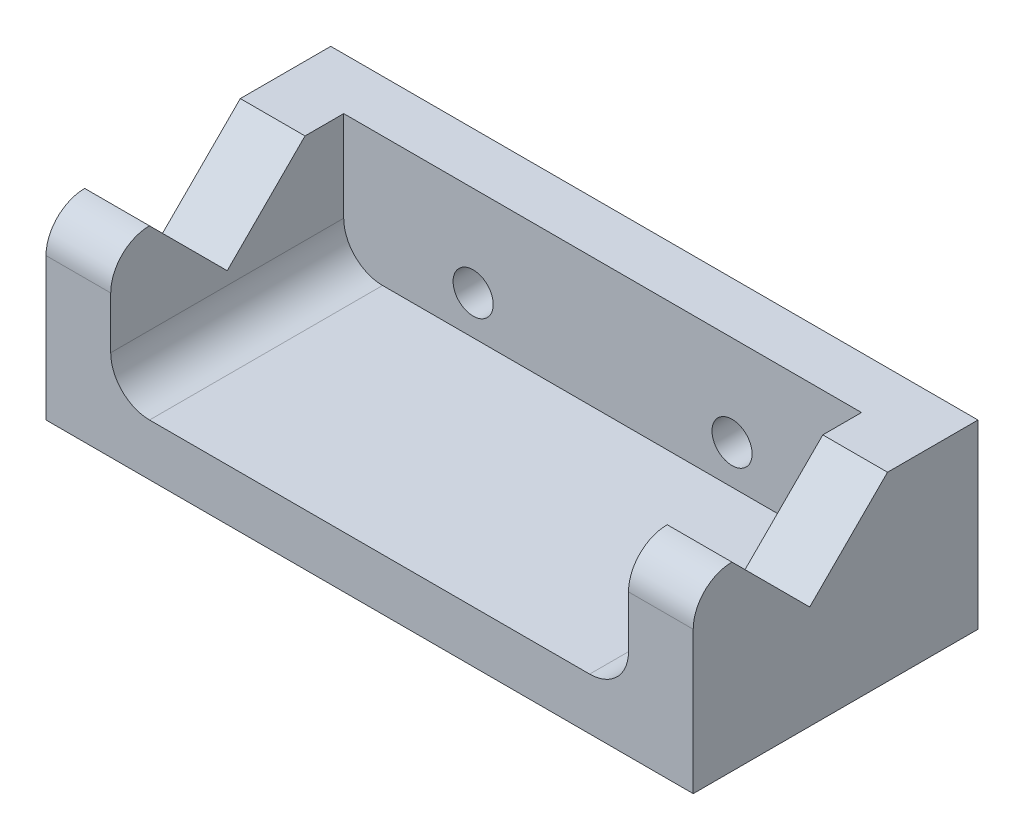
ISO-10303-21;
HEADER;
FILE_DESCRIPTION(('STEP AP214'),'2;1');
FILE_NAME('part.step','',(''),(''),'','','');
FILE_SCHEMA(('AUTOMOTIVE_DESIGN { 1 0 10303 214 1 1 1 1 }'));
ENDSEC;
DATA;
#1=APPLICATION_CONTEXT('core data for automotive mechanical design processes');
#2=APPLICATION_PROTOCOL_DEFINITION('international standard','automotive_design',2000,#1);
#3=PRODUCT_CONTEXT('',#1,'mechanical');
#4=PRODUCT('Part','Part','',(#3));
#5=PRODUCT_RELATED_PRODUCT_CATEGORY('part','',(#4));
#6=PRODUCT_DEFINITION_FORMATION('','',#4);
#7=PRODUCT_DEFINITION_CONTEXT('part definition',#1,'design');
#8=PRODUCT_DEFINITION('design','',#6,#7);
#9=PRODUCT_DEFINITION_SHAPE('','',#8);
#10=(LENGTH_UNIT() NAMED_UNIT(*) SI_UNIT(.MILLI.,.METRE.));
#11=(NAMED_UNIT(*) PLANE_ANGLE_UNIT() SI_UNIT($,.RADIAN.));
#12=(NAMED_UNIT(*) SI_UNIT($,.STERADIAN.) SOLID_ANGLE_UNIT());
#13=UNCERTAINTY_MEASURE_WITH_UNIT(LENGTH_MEASURE(1.E-05),#10,'distance_accuracy_value','');
#14=(GEOMETRIC_REPRESENTATION_CONTEXT(3) GLOBAL_UNCERTAINTY_ASSIGNED_CONTEXT((#13)) GLOBAL_UNIT_ASSIGNED_CONTEXT((#10,
#11,#12)) REPRESENTATION_CONTEXT('',''));
#15=CARTESIAN_POINT('',(0.,0.,0.));
#16=DIRECTION('',(0.,0.,1.));
#17=DIRECTION('',(1.,0.,0.));
#18=AXIS2_PLACEMENT_3D('',#15,#16,#17);
#19=CARTESIAN_POINT('',(0.,14.,0.));
#20=DIRECTION('',(0.,1.,0.));
#21=DIRECTION('',(0.,0.,1.));
#22=AXIS2_PLACEMENT_3D('',#19,#20,#21);
#23=PLANE('',#22);
#24=DIRECTION('',(-1.,0.,0.));
#25=VECTOR('',#24,1.);
#26=CARTESIAN_POINT('',(0.,14.,-6.01040764008566));
#27=LINE('',#26,#25);
#28=CARTESIAN_POINT('',(-20.,14.,-6.01040764008566));
#29=VERTEX_POINT('',#28);
#30=CARTESIAN_POINT('',(-25.,14.,-6.01040764008566));
#31=VERTEX_POINT('',#30);
#32=EDGE_CURVE('E297',#29,#31,#27,.T.);
#33=ORIENTED_EDGE('',*,*,#32,.F.);
#34=DIRECTION('',(0.,0.,-1.));
#35=VECTOR('',#34,1.);
#36=CARTESIAN_POINT('',(-20.,14.,-9.));
#37=LINE('',#36,#35);
#38=CARTESIAN_POINT('',(-20.,14.,-9.));
#39=VERTEX_POINT('',#38);
#40=EDGE_CURVE('E252',#29,#39,#37,.T.);
#41=ORIENTED_EDGE('',*,*,#40,.T.);
#42=DIRECTION('',(1.,0.,0.));
#43=VECTOR('',#42,1.);
#44=CARTESIAN_POINT('',(25.,14.,-9.));
#45=LINE('',#44,#43);
#46=CARTESIAN_POINT('',(20.,14.,-9.));
#47=VERTEX_POINT('',#46);
#48=EDGE_CURVE('E190',#39,#47,#45,.T.);
#49=ORIENTED_EDGE('',*,*,#48,.T.);
#50=DIRECTION('',(0.,0.,1.));
#51=VECTOR('',#50,1.);
#52=CARTESIAN_POINT('',(20.,14.,-9.));
#53=LINE('',#52,#51);
#54=CARTESIAN_POINT('',(20.,14.,-6.01040764008566));
#55=VERTEX_POINT('',#54);
#56=EDGE_CURVE('E270',#47,#55,#53,.T.);
#57=ORIENTED_EDGE('',*,*,#56,.T.);
#58=DIRECTION('',(-1.,0.,0.));
#59=VECTOR('',#58,1.);
#60=CARTESIAN_POINT('',(25.,14.,-6.01040764008566));
#61=LINE('',#60,#59);
#62=CARTESIAN_POINT('',(25.,14.,-6.01040764008566));
#63=VERTEX_POINT('',#62);
#64=EDGE_CURVE('E220',#63,#55,#61,.T.);
#65=ORIENTED_EDGE('',*,*,#64,.F.);
#66=DIRECTION('',(0.,0.,-1.));
#67=VECTOR('',#66,1.);
#68=CARTESIAN_POINT('',(25.,14.,-9.));
#69=LINE('',#68,#67);
#70=CARTESIAN_POINT('',(25.,14.,-13.));
#71=VERTEX_POINT('',#70);
#72=EDGE_CURVE('E253',#63,#71,#69,.T.);
#73=ORIENTED_EDGE('',*,*,#72,.T.);
#74=DIRECTION('',(1.,0.,0.));
#75=VECTOR('',#74,1.);
#76=CARTESIAN_POINT('',(25.,14.,-13.));
#77=LINE('',#76,#75);
#78=CARTESIAN_POINT('',(-25.,14.,-13.));
#79=VERTEX_POINT('',#78);
#80=EDGE_CURVE('E188',#79,#71,#77,.T.);
#81=ORIENTED_EDGE('',*,*,#80,.F.);
#82=DIRECTION('',(0.,0.,1.));
#83=VECTOR('',#82,1.);
#84=CARTESIAN_POINT('',(-25.,14.,-9.));
#85=LINE('',#84,#83);
#86=EDGE_CURVE('E248',#79,#31,#85,.T.);
#87=ORIENTED_EDGE('',*,*,#86,.T.);
#88=EDGE_LOOP('',(#33,#41,#49,#57,#65,#73,#81,#87));
#89=FACE_BOUND('',#88,.T.);
#90=ADVANCED_FACE('F45',(#89),#23,.T.);
#91=CARTESIAN_POINT('',(25.,4.,-9.));
#92=DIRECTION('',(-1.,0.,0.));
#93=DIRECTION('',(0.,0.,1.));
#94=AXIS2_PLACEMENT_3D('',#91,#92,#93);
#95=PLANE('',#94);
#96=DIRECTION('',(0.,0.707106781186547,0.707106781186547));
#97=VECTOR('',#96,1.);
#98=CARTESIAN_POINT('',(25.,14.,6.01040764008565));
#99=LINE('',#98,#97);
#100=CARTESIAN_POINT('',(25.,7.98959235991435,0.));
#101=VERTEX_POINT('',#100);
#102=CARTESIAN_POINT('',(25.,14.,6.01040764008565));
#103=VERTEX_POINT('',#102);
#104=EDGE_CURVE('E209',#101,#103,#99,.T.);
#105=ORIENTED_EDGE('',*,*,#104,.T.);
#106=CARTESIAN_POINT('',(25.,11.0000180532163,6.));
#107=DIRECTION('',(-1.,0.,0.));
#108=DIRECTION('',(0.,0.,1.));
#109=AXIS2_PLACEMENT_3D('',#106,#107,#108);
#110=CIRCLE('',#109,3.);
#111=CARTESIAN_POINT('',(25.,11.0000180532163,9.));
#112=VERTEX_POINT('',#111);
#113=EDGE_CURVE('E300',#103,#112,#110,.F.);
#114=ORIENTED_EDGE('',*,*,#113,.T.);
#115=DIRECTION('',(0.,-1.,0.));
#116=VECTOR('',#115,1.);
#117=CARTESIAN_POINT('',(25.,4.,9.));
#118=LINE('',#117,#116);
#119=CARTESIAN_POINT('',(25.,0.,9.));
#120=VERTEX_POINT('',#119);
#121=EDGE_CURVE('E166',#112,#120,#118,.T.);
#122=ORIENTED_EDGE('',*,*,#121,.T.);
#123=DIRECTION('',(0.,0.,-1.));
#124=VECTOR('',#123,1.);
#125=CARTESIAN_POINT('',(25.,0.,-9.));
#126=LINE('',#125,#124);
#127=CARTESIAN_POINT('',(25.,0.,-13.));
#128=VERTEX_POINT('',#127);
#129=EDGE_CURVE('E158',#120,#128,#126,.T.);
#130=ORIENTED_EDGE('',*,*,#129,.T.);
#131=DIRECTION('',(0.,-1.,0.));
#132=VECTOR('',#131,1.);
#133=CARTESIAN_POINT('',(25.,14.,-13.));
#134=LINE('',#133,#132);
#135=EDGE_CURVE('E164',#71,#128,#134,.T.);
#136=ORIENTED_EDGE('',*,*,#135,.F.);
#137=ORIENTED_EDGE('',*,*,#72,.F.);
#138=DIRECTION('',(0.,-0.707106781186547,0.707106781186548));
#139=VECTOR('',#138,1.);
#140=CARTESIAN_POINT('',(25.,7.98959235991435,0.));
#141=LINE('',#140,#139);
#142=EDGE_CURVE('E205',#63,#101,#141,.T.);
#143=ORIENTED_EDGE('',*,*,#142,.T.);
#144=EDGE_LOOP('',(#105,#114,#122,#130,#136,#137,#143));
#145=FACE_BOUND('',#144,.T.);
#146=ADVANCED_FACE('F161',(#145),#95,.F.);
#147=CARTESIAN_POINT('',(-25.,4.,-9.));
#148=DIRECTION('',(1.,0.,0.));
#149=DIRECTION('',(0.,0.,-1.));
#150=AXIS2_PLACEMENT_3D('',#147,#148,#149);
#151=PLANE('',#150);
#152=DIRECTION('',(0.,-1.,0.));
#153=VECTOR('',#152,1.);
#154=CARTESIAN_POINT('',(-25.,4.,9.));
#155=LINE('',#154,#153);
#156=CARTESIAN_POINT('',(-25.,11.0000180532163,9.));
#157=VERTEX_POINT('',#156);
#158=CARTESIAN_POINT('',(-25.,0.,9.));
#159=VERTEX_POINT('',#158);
#160=EDGE_CURVE('E290',#157,#159,#155,.T.);
#161=ORIENTED_EDGE('',*,*,#160,.F.);
#162=CARTESIAN_POINT('',(-25.,11.0000180532163,6.));
#163=DIRECTION('',(1.,0.,0.));
#164=DIRECTION('',(0.,0.,-1.));
#165=AXIS2_PLACEMENT_3D('',#162,#163,#164);
#166=CIRCLE('',#165,3.);
#167=CARTESIAN_POINT('',(-25.,14.,6.01040764008565));
#168=VERTEX_POINT('',#167);
#169=EDGE_CURVE('E315',#157,#168,#166,.F.);
#170=ORIENTED_EDGE('',*,*,#169,.T.);
#171=DIRECTION('',(0.,0.707106781186547,0.707106781186547));
#172=VECTOR('',#171,1.);
#173=CARTESIAN_POINT('',(-25.,14.,6.01040764008565));
#174=LINE('',#173,#172);
#175=CARTESIAN_POINT('',(-25.,7.98959235991435,0.));
#176=VERTEX_POINT('',#175);
#177=EDGE_CURVE('E210',#176,#168,#174,.T.);
#178=ORIENTED_EDGE('',*,*,#177,.F.);
#179=DIRECTION('',(0.,-0.707106781186547,0.707106781186548));
#180=VECTOR('',#179,1.);
#181=CARTESIAN_POINT('',(-25.,7.98959235991435,0.));
#182=LINE('',#181,#180);
#183=EDGE_CURVE('E203',#31,#176,#182,.T.);
#184=ORIENTED_EDGE('',*,*,#183,.F.);
#185=ORIENTED_EDGE('',*,*,#86,.F.);
#186=DIRECTION('',(0.,1.,0.));
#187=VECTOR('',#186,1.);
#188=CARTESIAN_POINT('',(-25.,14.,-13.));
#189=LINE('',#188,#187);
#190=CARTESIAN_POINT('',(-25.,0.,-13.));
#191=VERTEX_POINT('',#190);
#192=EDGE_CURVE('E182',#191,#79,#189,.T.);
#193=ORIENTED_EDGE('',*,*,#192,.F.);
#194=DIRECTION('',(0.,0.,1.));
#195=VECTOR('',#194,1.);
#196=CARTESIAN_POINT('',(-25.,0.,-9.));
#197=LINE('',#196,#195);
#198=EDGE_CURVE('E171',#191,#159,#197,.T.);
#199=ORIENTED_EDGE('',*,*,#198,.T.);
#200=EDGE_LOOP('',(#161,#170,#178,#184,#185,#193,#199));
#201=FACE_BOUND('',#200,.T.);
#202=ADVANCED_FACE('F376',(#201),#151,.F.);
#203=CARTESIAN_POINT('',(-25.,4.,9.));
#204=DIRECTION('',(0.,0.,-1.));
#205=DIRECTION('',(-1.,0.,0.));
#206=AXIS2_PLACEMENT_3D('',#203,#204,#205);
#207=PLANE('',#206);
#208=ORIENTED_EDGE('',*,*,#121,.F.);
#209=DIRECTION('',(-1.,0.,0.));
#210=VECTOR('',#209,1.);
#211=CARTESIAN_POINT('',(-25.,11.0000180532163,9.));
#212=LINE('',#211,#210);
#213=CARTESIAN_POINT('',(20.,11.0000180532163,9.));
#214=VERTEX_POINT('',#213);
#215=EDGE_CURVE('E306',#112,#214,#212,.T.);
#216=ORIENTED_EDGE('',*,*,#215,.T.);
#217=DIRECTION('',(0.,-1.,0.));
#218=VECTOR('',#217,1.);
#219=CARTESIAN_POINT('',(20.,14.,9.));
#220=LINE('',#219,#218);
#221=CARTESIAN_POINT('',(20.,7.,9.));
#222=VERTEX_POINT('',#221);
#223=EDGE_CURVE('E267',#214,#222,#220,.T.);
#224=ORIENTED_EDGE('',*,*,#223,.T.);
#225=CARTESIAN_POINT('',(17.,7.,9.));
#226=DIRECTION('',(0.,0.,-1.));
#227=DIRECTION('',(-1.,0.,0.));
#228=AXIS2_PLACEMENT_3D('',#225,#226,#227);
#229=CIRCLE('',#228,3.);
#230=CARTESIAN_POINT('',(17.,4.,9.));
#231=VERTEX_POINT('',#230);
#232=EDGE_CURVE('E11',#222,#231,#229,.T.);
#233=ORIENTED_EDGE('',*,*,#232,.T.);
#234=DIRECTION('',(1.,0.,0.));
#235=VECTOR('',#234,1.);
#236=CARTESIAN_POINT('',(-25.,4.,9.));
#237=LINE('',#236,#235);
#238=CARTESIAN_POINT('',(-17.,4.,9.));
#239=VERTEX_POINT('',#238);
#240=EDGE_CURVE('E280',#239,#231,#237,.T.);
#241=ORIENTED_EDGE('',*,*,#240,.F.);
#242=CARTESIAN_POINT('',(-17.,7.,9.));
#243=DIRECTION('',(0.,0.,-1.));
#244=DIRECTION('',(-1.,0.,0.));
#245=AXIS2_PLACEMENT_3D('',#242,#243,#244);
#246=CIRCLE('',#245,3.);
#247=CARTESIAN_POINT('',(-20.,7.,9.));
#248=VERTEX_POINT('',#247);
#249=EDGE_CURVE('E54',#239,#248,#246,.T.);
#250=ORIENTED_EDGE('',*,*,#249,.T.);
#251=DIRECTION('',(0.,-1.,0.));
#252=VECTOR('',#251,1.);
#253=CARTESIAN_POINT('',(-20.,14.,9.));
#254=LINE('',#253,#252);
#255=CARTESIAN_POINT('',(-20.,11.0000180532163,9.));
#256=VERTEX_POINT('',#255);
#257=EDGE_CURVE('E172',#256,#248,#254,.T.);
#258=ORIENTED_EDGE('',*,*,#257,.F.);
#259=DIRECTION('',(1.,0.,0.));
#260=VECTOR('',#259,1.);
#261=CARTESIAN_POINT('',(-25.,11.0000180532163,9.));
#262=LINE('',#261,#260);
#263=EDGE_CURVE('E303',#256,#157,#262,.F.);
#264=ORIENTED_EDGE('',*,*,#263,.T.);
#265=ORIENTED_EDGE('',*,*,#160,.T.);
#266=DIRECTION('',(1.,0.,0.));
#267=VECTOR('',#266,1.);
#268=CARTESIAN_POINT('',(-25.,0.,9.));
#269=LINE('',#268,#267);
#270=EDGE_CURVE('E281',#159,#120,#269,.T.);
#271=ORIENTED_EDGE('',*,*,#270,.T.);
#272=EDGE_LOOP('',(#208,#216,#224,#233,#241,#250,#258,#264,#265,#271));
#273=FACE_BOUND('',#272,.T.);
#274=ADVANCED_FACE('F339',(#273),#207,.F.);
#275=CARTESIAN_POINT('',(0.,4.,0.));
#276=DIRECTION('',(0.,1.,0.));
#277=DIRECTION('',(0.,0.,1.));
#278=AXIS2_PLACEMENT_3D('',#275,#276,#277);
#279=PLANE('',#278);
#280=DIRECTION('',(-1.,0.,0.));
#281=VECTOR('',#280,1.);
#282=CARTESIAN_POINT('',(-25.,4.,-9.));
#283=LINE('',#282,#281);
#284=CARTESIAN_POINT('',(17.,4.,-9.));
#285=VERTEX_POINT('',#284);
#286=CARTESIAN_POINT('',(-17.,4.,-9.));
#287=VERTEX_POINT('',#286);
#288=EDGE_CURVE('E276',#285,#287,#283,.T.);
#289=ORIENTED_EDGE('',*,*,#288,.T.);
#290=DIRECTION('',(0.,0.,-1.));
#291=VECTOR('',#290,1.);
#292=CARTESIAN_POINT('',(-17.,4.,0.));
#293=LINE('',#292,#291);
#294=EDGE_CURVE('E331',#287,#239,#293,.F.);
#295=ORIENTED_EDGE('',*,*,#294,.T.);
#296=ORIENTED_EDGE('',*,*,#240,.T.);
#297=DIRECTION('',(0.,0.,1.));
#298=VECTOR('',#297,1.);
#299=CARTESIAN_POINT('',(17.,4.,0.));
#300=LINE('',#299,#298);
#301=EDGE_CURVE('E328',#231,#285,#300,.F.);
#302=ORIENTED_EDGE('',*,*,#301,.T.);
#303=EDGE_LOOP('',(#289,#295,#296,#302));
#304=FACE_BOUND('',#303,.T.);
#305=ADVANCED_FACE('F353',(#304),#279,.T.);
#306=CARTESIAN_POINT('',(0.,0.,0.));
#307=DIRECTION('',(0.,1.,0.));
#308=DIRECTION('',(0.,0.,1.));
#309=AXIS2_PLACEMENT_3D('',#306,#307,#308);
#310=PLANE('',#309);
#311=ORIENTED_EDGE('',*,*,#129,.F.);
#312=ORIENTED_EDGE('',*,*,#270,.F.);
#313=ORIENTED_EDGE('',*,*,#198,.F.);
#314=DIRECTION('',(-1.,0.,0.));
#315=VECTOR('',#314,1.);
#316=CARTESIAN_POINT('',(25.,0.,-13.));
#317=LINE('',#316,#315);
#318=EDGE_CURVE('E175',#128,#191,#317,.T.);
#319=ORIENTED_EDGE('',*,*,#318,.F.);
#320=EDGE_LOOP('',(#311,#312,#313,#319));
#321=FACE_BOUND('',#320,.T.);
#322=ADVANCED_FACE('F176',(#321),#310,.F.);
#323=CARTESIAN_POINT('',(20.,14.,-9.));
#324=DIRECTION('',(1.,0.,0.));
#325=DIRECTION('',(0.,0.,-1.));
#326=AXIS2_PLACEMENT_3D('',#323,#324,#325);
#327=PLANE('',#326);
#328=DIRECTION('',(0.,-1.,0.));
#329=VECTOR('',#328,1.);
#330=CARTESIAN_POINT('',(20.,14.,-9.));
#331=LINE('',#330,#329);
#332=CARTESIAN_POINT('',(20.,7.,-9.));
#333=VERTEX_POINT('',#332);
#334=EDGE_CURVE('E247',#47,#333,#331,.T.);
#335=ORIENTED_EDGE('',*,*,#334,.T.);
#336=DIRECTION('',(0.,0.,1.));
#337=VECTOR('',#336,1.);
#338=CARTESIAN_POINT('',(20.,7.,-9.));
#339=LINE('',#338,#337);
#340=EDGE_CURVE('E334',#333,#222,#339,.T.);
#341=ORIENTED_EDGE('',*,*,#340,.T.);
#342=ORIENTED_EDGE('',*,*,#223,.F.);
#343=CARTESIAN_POINT('',(20.,11.0000180532163,6.));
#344=DIRECTION('',(1.,0.,0.));
#345=DIRECTION('',(0.,0.,-1.));
#346=AXIS2_PLACEMENT_3D('',#343,#344,#345);
#347=CIRCLE('',#346,3.);
#348=CARTESIAN_POINT('',(20.,14.,6.01040764008566));
#349=VERTEX_POINT('',#348);
#350=EDGE_CURVE('E309',#214,#349,#347,.F.);
#351=ORIENTED_EDGE('',*,*,#350,.T.);
#352=DIRECTION('',(0.,-0.707106781186548,-0.707106781186548));
#353=VECTOR('',#352,1.);
#354=CARTESIAN_POINT('',(20.,6.49479617995717,-1.49479617995717));
#355=LINE('',#354,#353);
#356=CARTESIAN_POINT('',(20.,7.98959235991435,0.));
#357=VERTEX_POINT('',#356);
#358=EDGE_CURVE('E235',#349,#357,#355,.T.);
#359=ORIENTED_EDGE('',*,*,#358,.T.);
#360=DIRECTION('',(0.,0.707106781186547,-0.707106781186548));
#361=VECTOR('',#360,1.);
#362=CARTESIAN_POINT('',(20.,15.4947961799572,-7.50520382004283));
#363=LINE('',#362,#361);
#364=EDGE_CURVE('E243',#357,#55,#363,.T.);
#365=ORIENTED_EDGE('',*,*,#364,.T.);
#366=ORIENTED_EDGE('',*,*,#56,.F.);
#367=EDGE_LOOP('',(#335,#341,#342,#351,#359,#365,#366));
#368=FACE_BOUND('',#367,.T.);
#369=ADVANCED_FACE('F356',(#368),#327,.F.);
#370=CARTESIAN_POINT('',(-20.,14.,-9.));
#371=DIRECTION('',(-1.,0.,0.));
#372=DIRECTION('',(0.,0.,1.));
#373=AXIS2_PLACEMENT_3D('',#370,#371,#372);
#374=PLANE('',#373);
#375=ORIENTED_EDGE('',*,*,#257,.T.);
#376=DIRECTION('',(0.,0.,-1.));
#377=VECTOR('',#376,1.);
#378=CARTESIAN_POINT('',(-20.,7.,-9.));
#379=LINE('',#378,#377);
#380=CARTESIAN_POINT('',(-20.,7.,-9.));
#381=VERTEX_POINT('',#380);
#382=EDGE_CURVE('E318',#248,#381,#379,.T.);
#383=ORIENTED_EDGE('',*,*,#382,.T.);
#384=DIRECTION('',(0.,-1.,0.));
#385=VECTOR('',#384,1.);
#386=CARTESIAN_POINT('',(-20.,14.,-9.));
#387=LINE('',#386,#385);
#388=EDGE_CURVE('E257',#39,#381,#387,.T.);
#389=ORIENTED_EDGE('',*,*,#388,.F.);
#390=ORIENTED_EDGE('',*,*,#40,.F.);
#391=DIRECTION('',(0.,-0.707106781186547,0.707106781186548));
#392=VECTOR('',#391,1.);
#393=CARTESIAN_POINT('',(-20.,15.4947961799572,-7.50520382004283));
#394=LINE('',#393,#392);
#395=CARTESIAN_POINT('',(-20.,7.98959235991435,0.));
#396=VERTEX_POINT('',#395);
#397=EDGE_CURVE('E239',#29,#396,#394,.T.);
#398=ORIENTED_EDGE('',*,*,#397,.T.);
#399=DIRECTION('',(0.,0.707106781186548,0.707106781186548));
#400=VECTOR('',#399,1.);
#401=CARTESIAN_POINT('',(-20.,6.49479617995717,-1.49479617995717));
#402=LINE('',#401,#400);
#403=CARTESIAN_POINT('',(-20.,14.,6.01040764008565));
#404=VERTEX_POINT('',#403);
#405=EDGE_CURVE('E223',#396,#404,#402,.T.);
#406=ORIENTED_EDGE('',*,*,#405,.T.);
#407=CARTESIAN_POINT('',(-20.,11.0000180532163,6.));
#408=DIRECTION('',(-1.,0.,0.));
#409=DIRECTION('',(0.,0.,1.));
#410=AXIS2_PLACEMENT_3D('',#407,#408,#409);
#411=CIRCLE('',#410,3.);
#412=EDGE_CURVE('E312',#404,#256,#411,.F.);
#413=ORIENTED_EDGE('',*,*,#412,.T.);
#414=EDGE_LOOP('',(#375,#383,#389,#390,#398,#406,#413));
#415=FACE_BOUND('',#414,.T.);
#416=ADVANCED_FACE('F345',(#415),#374,.F.);
#417=CARTESIAN_POINT('',(25.,14.,6.01040764008565));
#418=DIRECTION('',(0.,-0.707106781186547,0.707106781186547));
#419=DIRECTION('',(0.,-0.707106781186548,-0.707106781186548));
#420=AXIS2_PLACEMENT_3D('',#417,#418,#419);
#421=PLANE('',#420);
#422=DIRECTION('',(-1.,0.,0.));
#423=VECTOR('',#422,1.);
#424=CARTESIAN_POINT('',(25.,7.98959235991435,0.));
#425=LINE('',#424,#423);
#426=EDGE_CURVE('E213',#396,#176,#425,.T.);
#427=ORIENTED_EDGE('',*,*,#426,.T.);
#428=ORIENTED_EDGE('',*,*,#177,.T.);
#429=DIRECTION('',(1.,0.,0.));
#430=VECTOR('',#429,1.);
#431=CARTESIAN_POINT('',(0.,14.,6.01040764008566));
#432=LINE('',#431,#430);
#433=EDGE_CURVE('E293',#168,#404,#432,.T.);
#434=ORIENTED_EDGE('',*,*,#433,.T.);
#435=ORIENTED_EDGE('',*,*,#405,.F.);
#436=EDGE_LOOP('',(#427,#428,#434,#435));
#437=FACE_BOUND('',#436,.T.);
#438=ADVANCED_FACE('F369',(#437),#421,.F.);
#439=CARTESIAN_POINT('',(25.,7.98959235991435,0.));
#440=DIRECTION('',(0.,-0.707106781186548,-0.707106781186547));
#441=DIRECTION('',(0.,0.707106781186547,-0.707106781186548));
#442=AXIS2_PLACEMENT_3D('',#439,#440,#441);
#443=PLANE('',#442);
#444=ORIENTED_EDGE('',*,*,#32,.T.);
#445=ORIENTED_EDGE('',*,*,#183,.T.);
#446=ORIENTED_EDGE('',*,*,#426,.F.);
#447=ORIENTED_EDGE('',*,*,#397,.F.);
#448=EDGE_LOOP('',(#444,#445,#446,#447));
#449=FACE_BOUND('',#448,.T.);
#450=ADVANCED_FACE('F364',(#449),#443,.F.);
#451=EDGE_CURVE('E228',#101,#357,#425,.T.);
#452=ORIENTED_EDGE('',*,*,#451,.F.);
#453=ORIENTED_EDGE('',*,*,#142,.F.);
#454=ORIENTED_EDGE('',*,*,#64,.T.);
#455=ORIENTED_EDGE('',*,*,#364,.F.);
#456=EDGE_LOOP('',(#452,#453,#454,#455));
#457=FACE_BOUND('',#456,.T.);
#458=ADVANCED_FACE('F387',(#457),#443,.F.);
#459=DIRECTION('',(-1.,0.,0.));
#460=VECTOR('',#459,1.);
#461=CARTESIAN_POINT('',(25.,14.,6.01040764008565));
#462=LINE('',#461,#460);
#463=EDGE_CURVE('E224',#103,#349,#462,.T.);
#464=ORIENTED_EDGE('',*,*,#463,.F.);
#465=ORIENTED_EDGE('',*,*,#104,.F.);
#466=ORIENTED_EDGE('',*,*,#451,.T.);
#467=ORIENTED_EDGE('',*,*,#358,.F.);
#468=EDGE_LOOP('',(#464,#465,#466,#467));
#469=FACE_BOUND('',#468,.T.);
#470=ADVANCED_FACE('F384',(#469),#421,.F.);
#471=CARTESIAN_POINT('',(0.,0.,-9.));
#472=DIRECTION('',(0.,0.,-1.));
#473=DIRECTION('',(-1.,0.,0.));
#474=AXIS2_PLACEMENT_3D('',#471,#472,#473);
#475=PLANE('',#474);
#476=CARTESIAN_POINT('',(10.,7.,-9.));
#477=DIRECTION('',(0.,0.,-1.));
#478=DIRECTION('',(-1.,0.,0.));
#479=AXIS2_PLACEMENT_3D('',#476,#477,#478);
#480=CIRCLE('',#479,1.55);
#481=CARTESIAN_POINT('',(8.45,7.,-9.));
#482=VERTEX_POINT('',#481);
#483=EDGE_CURVE('E197',#482,#482,#480,.T.);
#484=ORIENTED_EDGE('',*,*,#483,.T.);
#485=EDGE_LOOP('',(#484));
#486=FACE_BOUND('',#485,.T.);
#487=CARTESIAN_POINT('',(-10.,7.,-9.));
#488=DIRECTION('',(0.,0.,-1.));
#489=DIRECTION('',(-1.,0.,0.));
#490=AXIS2_PLACEMENT_3D('',#487,#488,#489);
#491=CIRCLE('',#490,1.55);
#492=CARTESIAN_POINT('',(-11.55,7.,-9.));
#493=VERTEX_POINT('',#492);
#494=EDGE_CURVE('E582',#493,#493,#491,.T.);
#495=ORIENTED_EDGE('',*,*,#494,.T.);
#496=EDGE_LOOP('',(#495));
#497=FACE_BOUND('',#496,.T.);
#498=ORIENTED_EDGE('',*,*,#388,.T.);
#499=CARTESIAN_POINT('',(-17.,7.,-9.));
#500=DIRECTION('',(0.,0.,-1.));
#501=DIRECTION('',(-1.,0.,0.));
#502=AXIS2_PLACEMENT_3D('',#499,#500,#501);
#503=CIRCLE('',#502,3.);
#504=EDGE_CURVE('E325',#381,#287,#503,.F.);
#505=ORIENTED_EDGE('',*,*,#504,.T.);
#506=ORIENTED_EDGE('',*,*,#288,.F.);
#507=CARTESIAN_POINT('',(17.,7.,-9.));
#508=DIRECTION('',(0.,0.,-1.));
#509=DIRECTION('',(-1.,0.,0.));
#510=AXIS2_PLACEMENT_3D('',#507,#508,#509);
#511=CIRCLE('',#510,3.);
#512=EDGE_CURVE('E322',#285,#333,#511,.F.);
#513=ORIENTED_EDGE('',*,*,#512,.T.);
#514=ORIENTED_EDGE('',*,*,#334,.F.);
#515=ORIENTED_EDGE('',*,*,#48,.F.);
#516=EDGE_LOOP('',(#498,#505,#506,#513,#514,#515));
#517=FACE_BOUND('',#516,.T.);
#518=ADVANCED_FACE('F350',(#486,#497,#517),#475,.F.);
#519=CARTESIAN_POINT('',(0.,0.,-13.));
#520=DIRECTION('',(0.,0.,-1.));
#521=DIRECTION('',(-1.,0.,0.));
#522=AXIS2_PLACEMENT_3D('',#519,#520,#521);
#523=PLANE('',#522);
#524=CARTESIAN_POINT('',(10.,7.,-13.));
#525=DIRECTION('',(0.,0.,-1.));
#526=DIRECTION('',(-1.,0.,0.));
#527=AXIS2_PLACEMENT_3D('',#524,#525,#526);
#528=CIRCLE('',#527,1.55);
#529=CARTESIAN_POINT('',(8.45,7.,-13.));
#530=VERTEX_POINT('',#529);
#531=EDGE_CURVE('E194',#530,#530,#528,.T.);
#532=ORIENTED_EDGE('',*,*,#531,.F.);
#533=EDGE_LOOP('',(#532));
#534=FACE_BOUND('',#533,.T.);
#535=ORIENTED_EDGE('',*,*,#135,.T.);
#536=ORIENTED_EDGE('',*,*,#318,.T.);
#537=ORIENTED_EDGE('',*,*,#192,.T.);
#538=ORIENTED_EDGE('',*,*,#80,.T.);
#539=EDGE_LOOP('',(#535,#536,#537,#538));
#540=FACE_BOUND('',#539,.T.);
#541=CARTESIAN_POINT('',(-10.,7.,-13.));
#542=DIRECTION('',(0.,0.,-1.));
#543=DIRECTION('',(-1.,0.,0.));
#544=AXIS2_PLACEMENT_3D('',#541,#542,#543);
#545=CIRCLE('',#544,1.55);
#546=CARTESIAN_POINT('',(-11.55,7.,-13.));
#547=VERTEX_POINT('',#546);
#548=EDGE_CURVE('E585',#547,#547,#545,.T.);
#549=ORIENTED_EDGE('',*,*,#548,.F.);
#550=EDGE_LOOP('',(#549));
#551=FACE_BOUND('',#550,.T.);
#552=ADVANCED_FACE('F185',(#534,#540,#551),#523,.T.);
#553=CARTESIAN_POINT('',(10.,7.,-13.));
#554=DIRECTION('',(0.,0.,1.));
#555=DIRECTION('',(1.,0.,0.));
#556=AXIS2_PLACEMENT_3D('',#553,#554,#555);
#557=CYLINDRICAL_SURFACE('',#556,1.55);
#558=ORIENTED_EDGE('',*,*,#531,.T.);
#559=EDGE_LOOP('',(#558));
#560=FACE_BOUND('',#559,.T.);
#561=ORIENTED_EDGE('',*,*,#483,.F.);
#562=EDGE_LOOP('',(#561));
#563=FACE_BOUND('',#562,.T.);
#564=ADVANCED_FACE('F451',(#560,#563),#557,.F.);
#565=CARTESIAN_POINT('',(-10.,7.,-13.));
#566=DIRECTION('',(0.,0.,1.));
#567=DIRECTION('',(1.,0.,0.));
#568=AXIS2_PLACEMENT_3D('',#565,#566,#567);
#569=CYLINDRICAL_SURFACE('',#568,1.55);
#570=ORIENTED_EDGE('',*,*,#548,.T.);
#571=EDGE_LOOP('',(#570));
#572=FACE_BOUND('',#571,.T.);
#573=ORIENTED_EDGE('',*,*,#494,.F.);
#574=EDGE_LOOP('',(#573));
#575=FACE_BOUND('',#574,.T.);
#576=ADVANCED_FACE('F416',(#572,#575),#569,.F.);
#577=CARTESIAN_POINT('',(0.,11.0000180532163,6.));
#578=DIRECTION('',(-1.,0.,0.));
#579=DIRECTION('',(0.,0.,1.));
#580=AXIS2_PLACEMENT_3D('',#577,#578,#579);
#581=CYLINDRICAL_SURFACE('',#580,3.);
#582=ORIENTED_EDGE('',*,*,#350,.F.);
#583=ORIENTED_EDGE('',*,*,#215,.F.);
#584=ORIENTED_EDGE('',*,*,#113,.F.);
#585=ORIENTED_EDGE('',*,*,#463,.T.);
#586=EDGE_LOOP('',(#582,#583,#584,#585));
#587=FACE_BOUND('',#586,.T.);
#588=ADVANCED_FACE('F380',(#587),#581,.T.);
#589=CARTESIAN_POINT('',(0.,11.0000180532163,6.));
#590=DIRECTION('',(1.,0.,0.));
#591=DIRECTION('',(0.,0.,-1.));
#592=AXIS2_PLACEMENT_3D('',#589,#590,#591);
#593=CYLINDRICAL_SURFACE('',#592,3.);
#594=ORIENTED_EDGE('',*,*,#169,.F.);
#595=ORIENTED_EDGE('',*,*,#263,.F.);
#596=ORIENTED_EDGE('',*,*,#412,.F.);
#597=ORIENTED_EDGE('',*,*,#433,.F.);
#598=EDGE_LOOP('',(#594,#595,#596,#597));
#599=FACE_BOUND('',#598,.T.);
#600=ADVANCED_FACE('F373',(#599),#593,.T.);
#601=CARTESIAN_POINT('',(-17.,7.,-9.));
#602=DIRECTION('',(0.,0.,-1.));
#603=DIRECTION('',(-1.,0.,0.));
#604=AXIS2_PLACEMENT_3D('',#601,#602,#603);
#605=CYLINDRICAL_SURFACE('',#604,3.);
#606=ORIENTED_EDGE('',*,*,#249,.F.);
#607=ORIENTED_EDGE('',*,*,#294,.F.);
#608=ORIENTED_EDGE('',*,*,#504,.F.);
#609=ORIENTED_EDGE('',*,*,#382,.F.);
#610=EDGE_LOOP('',(#606,#607,#608,#609));
#611=FACE_BOUND('',#610,.T.);
#612=ADVANCED_FACE('F347',(#611),#605,.F.);
#613=CARTESIAN_POINT('',(17.,7.,-9.));
#614=DIRECTION('',(0.,0.,1.));
#615=DIRECTION('',(1.,0.,0.));
#616=AXIS2_PLACEMENT_3D('',#613,#614,#615);
#617=CYLINDRICAL_SURFACE('',#616,3.);
#618=ORIENTED_EDGE('',*,*,#512,.F.);
#619=ORIENTED_EDGE('',*,*,#301,.F.);
#620=ORIENTED_EDGE('',*,*,#232,.F.);
#621=ORIENTED_EDGE('',*,*,#340,.F.);
#622=EDGE_LOOP('',(#618,#619,#620,#621));
#623=FACE_BOUND('',#622,.T.);
#624=ADVANCED_FACE('F47',(#623),#617,.F.);
#625=CLOSED_SHELL('',(#90,#146,#202,#274,#305,#322,#369,#416,#438,#450,#458,#470,#518,#552,#564,
#576,#588,#600,#612,#624));
#626=MANIFOLD_SOLID_BREP('B2',#625);
#627=ADVANCED_BREP_SHAPE_REPRESENTATION('',(#18,#626),#14);
#628=SHAPE_DEFINITION_REPRESENTATION(#9,#627);
ENDSEC;
END-ISO-10303-21;
